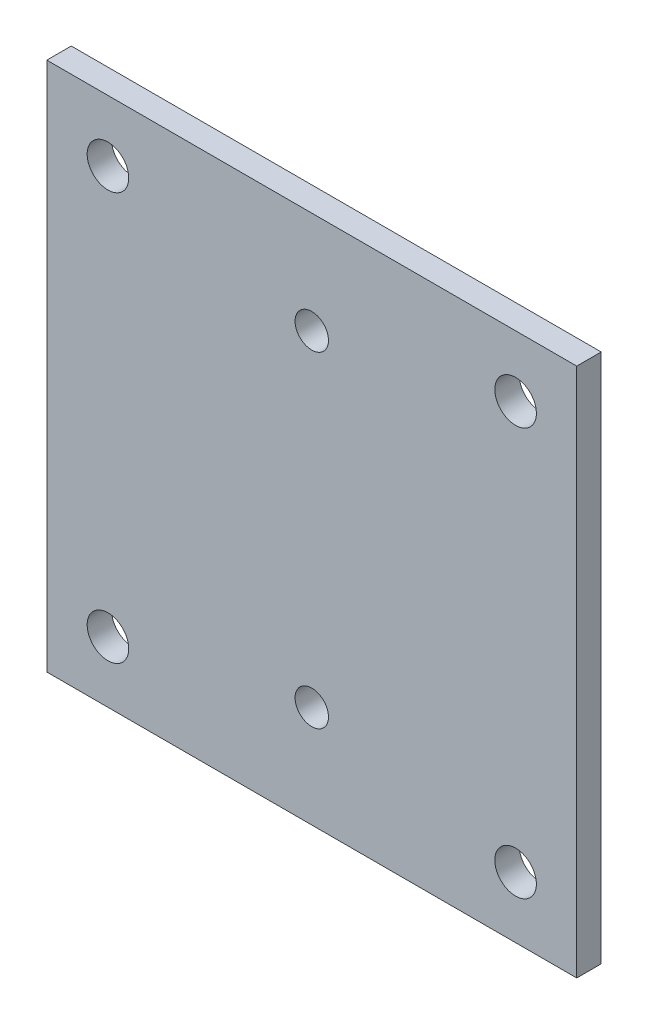
ISO-10303-21;
HEADER;
FILE_DESCRIPTION(('STEP AP214'),'2;1');
FILE_NAME('part.step','',(''),(''),'','','');
FILE_SCHEMA(('AUTOMOTIVE_DESIGN { 1 0 10303 214 1 1 1 1 }'));
ENDSEC;
DATA;
#1=APPLICATION_CONTEXT('core data for automotive mechanical design processes');
#2=APPLICATION_PROTOCOL_DEFINITION('international standard','automotive_design',2000,#1);
#3=PRODUCT_CONTEXT('',#1,'mechanical');
#4=PRODUCT('Part','Part','',(#3));
#5=PRODUCT_RELATED_PRODUCT_CATEGORY('part','',(#4));
#6=PRODUCT_DEFINITION_FORMATION('','',#4);
#7=PRODUCT_DEFINITION_CONTEXT('part definition',#1,'design');
#8=PRODUCT_DEFINITION('design','',#6,#7);
#9=PRODUCT_DEFINITION_SHAPE('','',#8);
#10=(LENGTH_UNIT() NAMED_UNIT(*) SI_UNIT(.MILLI.,.METRE.));
#11=(NAMED_UNIT(*) PLANE_ANGLE_UNIT() SI_UNIT($,.RADIAN.));
#12=(NAMED_UNIT(*) SI_UNIT($,.STERADIAN.) SOLID_ANGLE_UNIT());
#13=UNCERTAINTY_MEASURE_WITH_UNIT(LENGTH_MEASURE(1.E-05),#10,'distance_accuracy_value','');
#14=(GEOMETRIC_REPRESENTATION_CONTEXT(3) GLOBAL_UNCERTAINTY_ASSIGNED_CONTEXT((#13)) GLOBAL_UNIT_ASSIGNED_CONTEXT((#10,
#11,#12)) REPRESENTATION_CONTEXT('',''));
#15=CARTESIAN_POINT('',(0.,0.,0.));
#16=DIRECTION('',(0.,0.,1.));
#17=DIRECTION('',(1.,0.,0.));
#18=AXIS2_PLACEMENT_3D('',#15,#16,#17);
#19=CARTESIAN_POINT('',(0.,0.,3.));
#20=DIRECTION('',(0.,0.,1.));
#21=DIRECTION('',(1.,0.,0.));
#22=AXIS2_PLACEMENT_3D('',#19,#20,#21);
#23=PLANE('',#22);
#24=CARTESIAN_POINT('',(0.,20.,3.));
#25=DIRECTION('',(0.,0.,1.));
#26=DIRECTION('',(1.,0.,0.));
#27=AXIS2_PLACEMENT_3D('',#24,#25,#26);
#28=CIRCLE('',#27,2.05);
#29=CARTESIAN_POINT('',(2.05,20.,3.));
#30=VERTEX_POINT('',#29);
#31=EDGE_CURVE('E158',#30,#30,#28,.T.);
#32=ORIENTED_EDGE('',*,*,#31,.F.);
#33=EDGE_LOOP('',(#32));
#34=FACE_BOUND('',#33,.T.);
#35=CARTESIAN_POINT('',(-25.,-25.,3.));
#36=DIRECTION('',(0.,0.,1.));
#37=DIRECTION('',(1.,0.,0.));
#38=AXIS2_PLACEMENT_3D('',#35,#36,#37);
#39=CIRCLE('',#38,2.55);
#40=CARTESIAN_POINT('',(-22.45,-25.,3.));
#41=VERTEX_POINT('',#40);
#42=EDGE_CURVE('E142',#41,#41,#39,.T.);
#43=ORIENTED_EDGE('',*,*,#42,.F.);
#44=EDGE_LOOP('',(#43));
#45=FACE_BOUND('',#44,.T.);
#46=CARTESIAN_POINT('',(-25.,25.,3.));
#47=DIRECTION('',(0.,0.,1.));
#48=DIRECTION('',(1.,0.,0.));
#49=AXIS2_PLACEMENT_3D('',#46,#47,#48);
#50=CIRCLE('',#49,2.55);
#51=CARTESIAN_POINT('',(-22.45,25.,3.));
#52=VERTEX_POINT('',#51);
#53=EDGE_CURVE('E112',#52,#52,#50,.T.);
#54=ORIENTED_EDGE('',*,*,#53,.F.);
#55=EDGE_LOOP('',(#54));
#56=FACE_BOUND('',#55,.T.);
#57=DIRECTION('',(0.,1.,0.));
#58=VECTOR('',#57,1.);
#59=CARTESIAN_POINT('',(32.5,32.5,3.));
#60=LINE('',#59,#58);
#61=CARTESIAN_POINT('',(32.5,-32.5,3.));
#62=VERTEX_POINT('',#61);
#63=CARTESIAN_POINT('',(32.5,32.5,3.));
#64=VERTEX_POINT('',#63);
#65=EDGE_CURVE('E92',#62,#64,#60,.T.);
#66=ORIENTED_EDGE('',*,*,#65,.T.);
#67=DIRECTION('',(-1.,0.,0.));
#68=VECTOR('',#67,1.);
#69=CARTESIAN_POINT('',(-32.5,32.5,3.));
#70=LINE('',#69,#68);
#71=CARTESIAN_POINT('',(-32.5,32.5,3.));
#72=VERTEX_POINT('',#71);
#73=EDGE_CURVE('E87',#64,#72,#70,.T.);
#74=ORIENTED_EDGE('',*,*,#73,.T.);
#75=DIRECTION('',(0.,-1.,0.));
#76=VECTOR('',#75,1.);
#77=CARTESIAN_POINT('',(-32.5,32.5,3.));
#78=LINE('',#77,#76);
#79=CARTESIAN_POINT('',(-32.5,-32.5,3.));
#80=VERTEX_POINT('',#79);
#81=EDGE_CURVE('E90',#72,#80,#78,.T.);
#82=ORIENTED_EDGE('',*,*,#81,.T.);
#83=DIRECTION('',(1.,0.,0.));
#84=VECTOR('',#83,1.);
#85=CARTESIAN_POINT('',(-32.5,-32.5,3.));
#86=LINE('',#85,#84);
#87=EDGE_CURVE('E57',#80,#62,#86,.T.);
#88=ORIENTED_EDGE('',*,*,#87,.T.);
#89=EDGE_LOOP('',(#66,#74,#82,#88));
#90=FACE_BOUND('',#89,.T.);
#91=CARTESIAN_POINT('',(25.,25.,3.));
#92=DIRECTION('',(0.,0.,1.));
#93=DIRECTION('',(1.,0.,0.));
#94=AXIS2_PLACEMENT_3D('',#91,#92,#93);
#95=CIRCLE('',#94,2.55000000000001);
#96=CARTESIAN_POINT('',(27.55,25.,3.));
#97=VERTEX_POINT('',#96);
#98=EDGE_CURVE('E134',#97,#97,#95,.T.);
#99=ORIENTED_EDGE('',*,*,#98,.F.);
#100=EDGE_LOOP('',(#99));
#101=FACE_BOUND('',#100,.T.);
#102=CARTESIAN_POINT('',(25.,-25.,3.));
#103=DIRECTION('',(0.,0.,1.));
#104=DIRECTION('',(1.,0.,0.));
#105=AXIS2_PLACEMENT_3D('',#102,#103,#104);
#106=CIRCLE('',#105,2.55000000000001);
#107=CARTESIAN_POINT('',(27.55,-25.,3.));
#108=VERTEX_POINT('',#107);
#109=EDGE_CURVE('E150',#108,#108,#106,.T.);
#110=ORIENTED_EDGE('',*,*,#109,.F.);
#111=EDGE_LOOP('',(#110));
#112=FACE_BOUND('',#111,.T.);
#113=CARTESIAN_POINT('',(0.,-20.,3.));
#114=DIRECTION('',(0.,0.,1.));
#115=DIRECTION('',(1.,0.,0.));
#116=AXIS2_PLACEMENT_3D('',#113,#114,#115);
#117=CIRCLE('',#116,2.05);
#118=CARTESIAN_POINT('',(2.05,-20.,3.));
#119=VERTEX_POINT('',#118);
#120=EDGE_CURVE('E166',#119,#119,#117,.T.);
#121=ORIENTED_EDGE('',*,*,#120,.F.);
#122=EDGE_LOOP('',(#121));
#123=FACE_BOUND('',#122,.T.);
#124=ADVANCED_FACE('F39',(#34,#45,#56,#90,#101,#112,#123),#23,.T.);
#125=CARTESIAN_POINT('',(0.,0.,0.));
#126=DIRECTION('',(0.,0.,1.));
#127=DIRECTION('',(1.,0.,0.));
#128=AXIS2_PLACEMENT_3D('',#125,#126,#127);
#129=PLANE('',#128);
#130=DIRECTION('',(0.,1.,0.));
#131=VECTOR('',#130,1.);
#132=CARTESIAN_POINT('',(32.5,32.5,0.));
#133=LINE('',#132,#131);
#134=CARTESIAN_POINT('',(32.5,-32.5,0.));
#135=VERTEX_POINT('',#134);
#136=CARTESIAN_POINT('',(32.5,32.5,0.));
#137=VERTEX_POINT('',#136);
#138=EDGE_CURVE('E108',#135,#137,#133,.T.);
#139=ORIENTED_EDGE('',*,*,#138,.F.);
#140=DIRECTION('',(1.,0.,0.));
#141=VECTOR('',#140,1.);
#142=CARTESIAN_POINT('',(-32.5,-32.5,0.));
#143=LINE('',#142,#141);
#144=CARTESIAN_POINT('',(-32.5,-32.5,0.));
#145=VERTEX_POINT('',#144);
#146=EDGE_CURVE('E80',#145,#135,#143,.T.);
#147=ORIENTED_EDGE('',*,*,#146,.F.);
#148=DIRECTION('',(0.,-1.,0.));
#149=VECTOR('',#148,1.);
#150=CARTESIAN_POINT('',(-32.5,32.5,0.));
#151=LINE('',#150,#149);
#152=CARTESIAN_POINT('',(-32.5,32.5,0.));
#153=VERTEX_POINT('',#152);
#154=EDGE_CURVE('E74',#153,#145,#151,.T.);
#155=ORIENTED_EDGE('',*,*,#154,.F.);
#156=DIRECTION('',(-1.,0.,0.));
#157=VECTOR('',#156,1.);
#158=CARTESIAN_POINT('',(-32.5,32.5,0.));
#159=LINE('',#158,#157);
#160=EDGE_CURVE('E97',#137,#153,#159,.T.);
#161=ORIENTED_EDGE('',*,*,#160,.F.);
#162=EDGE_LOOP('',(#139,#147,#155,#161));
#163=FACE_BOUND('',#162,.T.);
#164=CARTESIAN_POINT('',(-25.,25.,0.));
#165=DIRECTION('',(0.,0.,1.));
#166=DIRECTION('',(1.,0.,0.));
#167=AXIS2_PLACEMENT_3D('',#164,#165,#166);
#168=CIRCLE('',#167,2.55);
#169=CARTESIAN_POINT('',(-22.45,25.,0.));
#170=VERTEX_POINT('',#169);
#171=EDGE_CURVE('E130',#170,#170,#168,.T.);
#172=ORIENTED_EDGE('',*,*,#171,.T.);
#173=EDGE_LOOP('',(#172));
#174=FACE_BOUND('',#173,.T.);
#175=CARTESIAN_POINT('',(25.,25.,0.));
#176=DIRECTION('',(0.,0.,1.));
#177=DIRECTION('',(1.,0.,0.));
#178=AXIS2_PLACEMENT_3D('',#175,#176,#177);
#179=CIRCLE('',#178,2.55000000000001);
#180=CARTESIAN_POINT('',(27.55,25.,0.));
#181=VERTEX_POINT('',#180);
#182=EDGE_CURVE('E138',#181,#181,#179,.T.);
#183=ORIENTED_EDGE('',*,*,#182,.T.);
#184=EDGE_LOOP('',(#183));
#185=FACE_BOUND('',#184,.T.);
#186=CARTESIAN_POINT('',(-25.,-25.,0.));
#187=DIRECTION('',(0.,0.,1.));
#188=DIRECTION('',(1.,0.,0.));
#189=AXIS2_PLACEMENT_3D('',#186,#187,#188);
#190=CIRCLE('',#189,2.55);
#191=CARTESIAN_POINT('',(-22.45,-25.,0.));
#192=VERTEX_POINT('',#191);
#193=EDGE_CURVE('E146',#192,#192,#190,.T.);
#194=ORIENTED_EDGE('',*,*,#193,.T.);
#195=EDGE_LOOP('',(#194));
#196=FACE_BOUND('',#195,.T.);
#197=CARTESIAN_POINT('',(25.,-25.,0.));
#198=DIRECTION('',(0.,0.,1.));
#199=DIRECTION('',(1.,0.,0.));
#200=AXIS2_PLACEMENT_3D('',#197,#198,#199);
#201=CIRCLE('',#200,2.55000000000001);
#202=CARTESIAN_POINT('',(27.55,-25.,0.));
#203=VERTEX_POINT('',#202);
#204=EDGE_CURVE('E154',#203,#203,#201,.T.);
#205=ORIENTED_EDGE('',*,*,#204,.T.);
#206=EDGE_LOOP('',(#205));
#207=FACE_BOUND('',#206,.T.);
#208=CARTESIAN_POINT('',(0.,20.,0.));
#209=DIRECTION('',(0.,0.,1.));
#210=DIRECTION('',(1.,0.,0.));
#211=AXIS2_PLACEMENT_3D('',#208,#209,#210);
#212=CIRCLE('',#211,2.05);
#213=CARTESIAN_POINT('',(2.05,20.,0.));
#214=VERTEX_POINT('',#213);
#215=EDGE_CURVE('E162',#214,#214,#212,.T.);
#216=ORIENTED_EDGE('',*,*,#215,.T.);
#217=EDGE_LOOP('',(#216));
#218=FACE_BOUND('',#217,.T.);
#219=CARTESIAN_POINT('',(0.,-20.,0.));
#220=DIRECTION('',(0.,0.,1.));
#221=DIRECTION('',(1.,0.,0.));
#222=AXIS2_PLACEMENT_3D('',#219,#220,#221);
#223=CIRCLE('',#222,2.05);
#224=CARTESIAN_POINT('',(2.05,-20.,0.));
#225=VERTEX_POINT('',#224);
#226=EDGE_CURVE('E170',#225,#225,#223,.T.);
#227=ORIENTED_EDGE('',*,*,#226,.T.);
#228=EDGE_LOOP('',(#227));
#229=FACE_BOUND('',#228,.T.);
#230=ADVANCED_FACE('F125',(#163,#174,#185,#196,#207,#218,#229),#129,.F.);
#231=CARTESIAN_POINT('',(32.5,32.5,3.));
#232=DIRECTION('',(-1.,0.,0.));
#233=DIRECTION('',(0.,0.,1.));
#234=AXIS2_PLACEMENT_3D('',#231,#232,#233);
#235=PLANE('',#234);
#236=ORIENTED_EDGE('',*,*,#138,.T.);
#237=DIRECTION('',(0.,0.,-1.));
#238=VECTOR('',#237,1.);
#239=CARTESIAN_POINT('',(32.5,32.5,3.));
#240=LINE('',#239,#238);
#241=EDGE_CURVE('E11',#64,#137,#240,.T.);
#242=ORIENTED_EDGE('',*,*,#241,.F.);
#243=ORIENTED_EDGE('',*,*,#65,.F.);
#244=DIRECTION('',(0.,0.,-1.));
#245=VECTOR('',#244,1.);
#246=CARTESIAN_POINT('',(32.5,-32.5,3.));
#247=LINE('',#246,#245);
#248=EDGE_CURVE('E104',#62,#135,#247,.T.);
#249=ORIENTED_EDGE('',*,*,#248,.T.);
#250=EDGE_LOOP('',(#236,#242,#243,#249));
#251=FACE_BOUND('',#250,.T.);
#252=ADVANCED_FACE('F41',(#251),#235,.F.);
#253=CARTESIAN_POINT('',(-32.5,32.5,3.));
#254=DIRECTION('',(0.,-1.,0.));
#255=DIRECTION('',(0.,0.,-1.));
#256=AXIS2_PLACEMENT_3D('',#253,#254,#255);
#257=PLANE('',#256);
#258=ORIENTED_EDGE('',*,*,#160,.T.);
#259=DIRECTION('',(0.,0.,-1.));
#260=VECTOR('',#259,1.);
#261=CARTESIAN_POINT('',(-32.5,32.5,3.));
#262=LINE('',#261,#260);
#263=EDGE_CURVE('E49',#72,#153,#262,.T.);
#264=ORIENTED_EDGE('',*,*,#263,.F.);
#265=ORIENTED_EDGE('',*,*,#73,.F.);
#266=ORIENTED_EDGE('',*,*,#241,.T.);
#267=EDGE_LOOP('',(#258,#264,#265,#266));
#268=FACE_BOUND('',#267,.T.);
#269=ADVANCED_FACE('F96',(#268),#257,.F.);
#270=CARTESIAN_POINT('',(-32.5,32.5,3.));
#271=DIRECTION('',(1.,0.,0.));
#272=DIRECTION('',(0.,1.,0.));
#273=AXIS2_PLACEMENT_3D('',#270,#271,#272);
#274=PLANE('',#273);
#275=ORIENTED_EDGE('',*,*,#154,.T.);
#276=DIRECTION('',(0.,0.,-1.));
#277=VECTOR('',#276,1.);
#278=CARTESIAN_POINT('',(-32.5,-32.5,3.));
#279=LINE('',#278,#277);
#280=EDGE_CURVE('E99',#80,#145,#279,.T.);
#281=ORIENTED_EDGE('',*,*,#280,.F.);
#282=ORIENTED_EDGE('',*,*,#81,.F.);
#283=ORIENTED_EDGE('',*,*,#263,.T.);
#284=EDGE_LOOP('',(#275,#281,#282,#283));
#285=FACE_BOUND('',#284,.T.);
#286=ADVANCED_FACE('F100',(#285),#274,.F.);
#287=CARTESIAN_POINT('',(-32.5,-32.5,3.));
#288=DIRECTION('',(0.,1.,0.));
#289=DIRECTION('',(0.,0.,1.));
#290=AXIS2_PLACEMENT_3D('',#287,#288,#289);
#291=PLANE('',#290);
#292=ORIENTED_EDGE('',*,*,#146,.T.);
#293=ORIENTED_EDGE('',*,*,#248,.F.);
#294=ORIENTED_EDGE('',*,*,#87,.F.);
#295=ORIENTED_EDGE('',*,*,#280,.T.);
#296=EDGE_LOOP('',(#292,#293,#294,#295));
#297=FACE_BOUND('',#296,.T.);
#298=ADVANCED_FACE('F122',(#297),#291,.F.);
#299=CARTESIAN_POINT('',(-25.,25.,3.));
#300=DIRECTION('',(0.,0.,-1.));
#301=DIRECTION('',(-1.,0.,0.));
#302=AXIS2_PLACEMENT_3D('',#299,#300,#301);
#303=CYLINDRICAL_SURFACE('',#302,2.55);
#304=ORIENTED_EDGE('',*,*,#53,.T.);
#305=EDGE_LOOP('',(#304));
#306=FACE_BOUND('',#305,.T.);
#307=ORIENTED_EDGE('',*,*,#171,.F.);
#308=EDGE_LOOP('',(#307));
#309=FACE_BOUND('',#308,.T.);
#310=ADVANCED_FACE('F191',(#306,#309),#303,.F.);
#311=CARTESIAN_POINT('',(25.,25.,3.));
#312=DIRECTION('',(0.,0.,-1.));
#313=DIRECTION('',(-1.,0.,0.));
#314=AXIS2_PLACEMENT_3D('',#311,#312,#313);
#315=CYLINDRICAL_SURFACE('',#314,2.55000000000001);
#316=ORIENTED_EDGE('',*,*,#98,.T.);
#317=EDGE_LOOP('',(#316));
#318=FACE_BOUND('',#317,.T.);
#319=ORIENTED_EDGE('',*,*,#182,.F.);
#320=EDGE_LOOP('',(#319));
#321=FACE_BOUND('',#320,.T.);
#322=ADVANCED_FACE('F237',(#318,#321),#315,.F.);
#323=CARTESIAN_POINT('',(-25.,-25.,3.));
#324=DIRECTION('',(0.,0.,-1.));
#325=DIRECTION('',(-1.,0.,0.));
#326=AXIS2_PLACEMENT_3D('',#323,#324,#325);
#327=CYLINDRICAL_SURFACE('',#326,2.55);
#328=ORIENTED_EDGE('',*,*,#42,.T.);
#329=EDGE_LOOP('',(#328));
#330=FACE_BOUND('',#329,.T.);
#331=ORIENTED_EDGE('',*,*,#193,.F.);
#332=EDGE_LOOP('',(#331));
#333=FACE_BOUND('',#332,.T.);
#334=ADVANCED_FACE('F245',(#330,#333),#327,.F.);
#335=CARTESIAN_POINT('',(25.,-25.,3.));
#336=DIRECTION('',(0.,0.,-1.));
#337=DIRECTION('',(-1.,0.,0.));
#338=AXIS2_PLACEMENT_3D('',#335,#336,#337);
#339=CYLINDRICAL_SURFACE('',#338,2.55000000000001);
#340=ORIENTED_EDGE('',*,*,#109,.T.);
#341=EDGE_LOOP('',(#340));
#342=FACE_BOUND('',#341,.T.);
#343=ORIENTED_EDGE('',*,*,#204,.F.);
#344=EDGE_LOOP('',(#343));
#345=FACE_BOUND('',#344,.T.);
#346=ADVANCED_FACE('F253',(#342,#345),#339,.F.);
#347=CARTESIAN_POINT('',(0.,20.,3.));
#348=DIRECTION('',(0.,0.,-1.));
#349=DIRECTION('',(-1.,0.,0.));
#350=AXIS2_PLACEMENT_3D('',#347,#348,#349);
#351=CYLINDRICAL_SURFACE('',#350,2.05);
#352=ORIENTED_EDGE('',*,*,#31,.T.);
#353=EDGE_LOOP('',(#352));
#354=FACE_BOUND('',#353,.T.);
#355=ORIENTED_EDGE('',*,*,#215,.F.);
#356=EDGE_LOOP('',(#355));
#357=FACE_BOUND('',#356,.T.);
#358=ADVANCED_FACE('F262',(#354,#357),#351,.F.);
#359=CARTESIAN_POINT('',(0.,-20.,3.));
#360=DIRECTION('',(0.,0.,-1.));
#361=DIRECTION('',(-1.,0.,0.));
#362=AXIS2_PLACEMENT_3D('',#359,#360,#361);
#363=CYLINDRICAL_SURFACE('',#362,2.05);
#364=ORIENTED_EDGE('',*,*,#120,.T.);
#365=EDGE_LOOP('',(#364));
#366=FACE_BOUND('',#365,.T.);
#367=ORIENTED_EDGE('',*,*,#226,.F.);
#368=EDGE_LOOP('',(#367));
#369=FACE_BOUND('',#368,.T.);
#370=ADVANCED_FACE('F178',(#366,#369),#363,.F.);
#371=CLOSED_SHELL('',(#124,#230,#252,#269,#286,#298,#310,#322,#334,#346,#358,#370));
#372=MANIFOLD_SOLID_BREP('B2',#371);
#373=ADVANCED_BREP_SHAPE_REPRESENTATION('',(#18,#372),#14);
#374=SHAPE_DEFINITION_REPRESENTATION(#9,#373);
ENDSEC;
END-ISO-10303-21;
